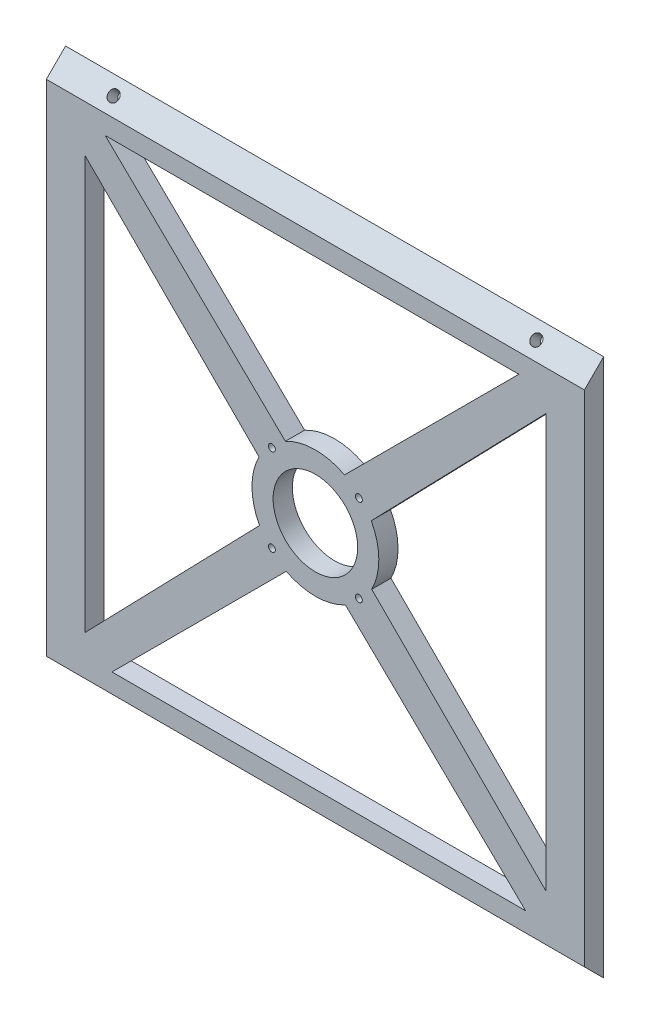
ISO-10303-21;
HEADER;
FILE_DESCRIPTION(('STEP AP214'),'2;1');
FILE_NAME('part.step','',(''),(''),'','','');
FILE_SCHEMA(('AUTOMOTIVE_DESIGN { 1 0 10303 214 1 1 1 1 }'));
ENDSEC;
DATA;
#1=APPLICATION_CONTEXT('core data for automotive mechanical design processes');
#2=APPLICATION_PROTOCOL_DEFINITION('international standard','automotive_design',2000,#1);
#3=PRODUCT_CONTEXT('',#1,'mechanical');
#4=PRODUCT('Part','Part','',(#3));
#5=PRODUCT_RELATED_PRODUCT_CATEGORY('part','',(#4));
#6=PRODUCT_DEFINITION_FORMATION('','',#4);
#7=PRODUCT_DEFINITION_CONTEXT('part definition',#1,'design');
#8=PRODUCT_DEFINITION('design','',#6,#7);
#9=PRODUCT_DEFINITION_SHAPE('','',#8);
#10=(LENGTH_UNIT() NAMED_UNIT(*) SI_UNIT(.MILLI.,.METRE.));
#11=(NAMED_UNIT(*) PLANE_ANGLE_UNIT() SI_UNIT($,.RADIAN.));
#12=(NAMED_UNIT(*) SI_UNIT($,.STERADIAN.) SOLID_ANGLE_UNIT());
#13=UNCERTAINTY_MEASURE_WITH_UNIT(LENGTH_MEASURE(1.E-05),#10,'distance_accuracy_value','');
#14=(GEOMETRIC_REPRESENTATION_CONTEXT(3) GLOBAL_UNCERTAINTY_ASSIGNED_CONTEXT((#13)) GLOBAL_UNIT_ASSIGNED_CONTEXT((#10,
#11,#12)) REPRESENTATION_CONTEXT('',''));
#15=CARTESIAN_POINT('',(0.,0.,0.));
#16=DIRECTION('',(0.,0.,1.));
#17=DIRECTION('',(1.,0.,0.));
#18=AXIS2_PLACEMENT_3D('',#15,#16,#17);
#19=CARTESIAN_POINT('',(70.,70.,5.));
#20=DIRECTION('',(-1.,0.,0.));
#21=DIRECTION('',(0.,0.,1.));
#22=AXIS2_PLACEMENT_3D('',#19,#20,#21);
#23=PLANE('',#22);
#24=DIRECTION('',(0.,1.,0.));
#25=VECTOR('',#24,1.);
#26=CARTESIAN_POINT('',(70.,70.,0.));
#27=LINE('',#26,#25);
#28=CARTESIAN_POINT('',(70.,-70.,0.));
#29=VERTEX_POINT('',#28);
#30=CARTESIAN_POINT('',(70.,70.,0.));
#31=VERTEX_POINT('',#30);
#32=EDGE_CURVE('E415',#29,#31,#27,.T.);
#33=ORIENTED_EDGE('',*,*,#32,.T.);
#34=DIRECTION('',(0.,-0.707106781186548,0.707106781186548));
#35=VECTOR('',#34,1.);
#36=CARTESIAN_POINT('',(70.,65.,5.));
#37=LINE('',#36,#35);
#38=CARTESIAN_POINT('',(70.,65.,5.));
#39=VERTEX_POINT('',#38);
#40=EDGE_CURVE('E11',#31,#39,#37,.T.);
#41=ORIENTED_EDGE('',*,*,#40,.T.);
#42=DIRECTION('',(0.,1.,0.));
#43=VECTOR('',#42,1.);
#44=CARTESIAN_POINT('',(70.,70.,5.));
#45=LINE('',#44,#43);
#46=CARTESIAN_POINT('',(70.,-65.,5.));
#47=VERTEX_POINT('',#46);
#48=EDGE_CURVE('E425',#47,#39,#45,.T.);
#49=ORIENTED_EDGE('',*,*,#48,.F.);
#50=DIRECTION('',(0.,-0.707106781186548,-0.707106781186548));
#51=VECTOR('',#50,1.);
#52=CARTESIAN_POINT('',(70.,-65.,5.));
#53=LINE('',#52,#51);
#54=EDGE_CURVE('E51',#47,#29,#53,.T.);
#55=ORIENTED_EDGE('',*,*,#54,.T.);
#56=EDGE_LOOP('',(#33,#41,#49,#55));
#57=FACE_BOUND('',#56,.T.);
#58=ADVANCED_FACE('F40',(#57),#23,.F.);
#59=CARTESIAN_POINT('',(-70.,70.,5.));
#60=DIRECTION('',(1.,0.,0.));
#61=DIRECTION('',(0.,0.,-1.));
#62=AXIS2_PLACEMENT_3D('',#59,#60,#61);
#63=PLANE('',#62);
#64=CARTESIAN_POINT('',(-70.,-63.,2.5));
#65=DIRECTION('',(-1.,0.,0.));
#66=DIRECTION('',(0.,0.,1.));
#67=AXIS2_PLACEMENT_3D('',#64,#65,#66);
#68=CIRCLE('',#67,1.4);
#69=CARTESIAN_POINT('',(-70.,-63.,3.9));
#70=VERTEX_POINT('',#69);
#71=EDGE_CURVE('E197',#70,#70,#68,.T.);
#72=ORIENTED_EDGE('',*,*,#71,.F.);
#73=EDGE_LOOP('',(#72));
#74=FACE_BOUND('',#73,.T.);
#75=CARTESIAN_POINT('',(-70.,63.,2.5));
#76=DIRECTION('',(-1.,0.,0.));
#77=DIRECTION('',(0.,0.,1.));
#78=AXIS2_PLACEMENT_3D('',#75,#76,#77);
#79=CIRCLE('',#78,1.4);
#80=CARTESIAN_POINT('',(-70.,63.,3.9));
#81=VERTEX_POINT('',#80);
#82=EDGE_CURVE('E196',#81,#81,#79,.T.);
#83=ORIENTED_EDGE('',*,*,#82,.F.);
#84=EDGE_LOOP('',(#83));
#85=FACE_BOUND('',#84,.T.);
#86=DIRECTION('',(0.,-1.,0.));
#87=VECTOR('',#86,1.);
#88=CARTESIAN_POINT('',(-70.,70.,5.));
#89=LINE('',#88,#87);
#90=CARTESIAN_POINT('',(-70.,65.,5.));
#91=VERTEX_POINT('',#90);
#92=CARTESIAN_POINT('',(-70.,-65.,5.));
#93=VERTEX_POINT('',#92);
#94=EDGE_CURVE('E429',#91,#93,#89,.T.);
#95=ORIENTED_EDGE('',*,*,#94,.F.);
#96=DIRECTION('',(0.,0.707106781186548,-0.707106781186548));
#97=VECTOR('',#96,1.);
#98=CARTESIAN_POINT('',(-70.,65.,5.));
#99=LINE('',#98,#97);
#100=CARTESIAN_POINT('',(-70.,70.,0.));
#101=VERTEX_POINT('',#100);
#102=EDGE_CURVE('E66',#91,#101,#99,.T.);
#103=ORIENTED_EDGE('',*,*,#102,.T.);
#104=DIRECTION('',(0.,-1.,0.));
#105=VECTOR('',#104,1.);
#106=CARTESIAN_POINT('',(-70.,70.,0.));
#107=LINE('',#106,#105);
#108=CARTESIAN_POINT('',(-70.,-70.,0.));
#109=VERTEX_POINT('',#108);
#110=EDGE_CURVE('E440',#101,#109,#107,.T.);
#111=ORIENTED_EDGE('',*,*,#110,.T.);
#112=DIRECTION('',(0.,0.707106781186548,0.707106781186548));
#113=VECTOR('',#112,1.);
#114=CARTESIAN_POINT('',(-70.,-65.,5.));
#115=LINE('',#114,#113);
#116=EDGE_CURVE('E58',#109,#93,#115,.T.);
#117=ORIENTED_EDGE('',*,*,#116,.T.);
#118=EDGE_LOOP('',(#95,#103,#111,#117));
#119=FACE_BOUND('',#118,.T.);
#120=ADVANCED_FACE('F472',(#74,#85,#119),#63,.F.);
#121=CARTESIAN_POINT('',(0.,0.,5.));
#122=DIRECTION('',(0.,0.,1.));
#123=DIRECTION('',(1.,0.,0.));
#124=AXIS2_PLACEMENT_3D('',#121,#122,#123);
#125=PLANE('',#124);
#126=CARTESIAN_POINT('',(-11.3137084989846,-11.3137084989849,5.));
#127=DIRECTION('',(0.,0.,1.));
#128=DIRECTION('',(1.,0.,0.));
#129=AXIS2_PLACEMENT_3D('',#126,#127,#128);
#130=CIRCLE('',#129,0.9);
#131=CARTESIAN_POINT('',(-10.4137084989846,-11.3137084989849,5.));
#132=VERTEX_POINT('',#131);
#133=EDGE_CURVE('E211',#132,#132,#130,.T.);
#134=ORIENTED_EDGE('',*,*,#133,.F.);
#135=EDGE_LOOP('',(#134));
#136=FACE_BOUND('',#135,.T.);
#137=CARTESIAN_POINT('',(-11.3137084989848,11.3137084989848,5.));
#138=DIRECTION('',(0.,0.,1.));
#139=DIRECTION('',(1.,0.,0.));
#140=AXIS2_PLACEMENT_3D('',#137,#138,#139);
#141=CIRCLE('',#140,0.9);
#142=CARTESIAN_POINT('',(-10.4137084989848,11.3137084989848,5.));
#143=VERTEX_POINT('',#142);
#144=EDGE_CURVE('E219',#143,#143,#141,.T.);
#145=ORIENTED_EDGE('',*,*,#144,.F.);
#146=EDGE_LOOP('',(#145));
#147=FACE_BOUND('',#146,.T.);
#148=CARTESIAN_POINT('',(11.3137084989847,11.3137084989848,5.));
#149=DIRECTION('',(0.,0.,1.));
#150=DIRECTION('',(1.,0.,0.));
#151=AXIS2_PLACEMENT_3D('',#148,#149,#150);
#152=CIRCLE('',#151,0.9);
#153=CARTESIAN_POINT('',(12.2137084989847,11.3137084989848,5.));
#154=VERTEX_POINT('',#153);
#155=EDGE_CURVE('E227',#154,#154,#152,.T.);
#156=ORIENTED_EDGE('',*,*,#155,.F.);
#157=EDGE_LOOP('',(#156));
#158=FACE_BOUND('',#157,.T.);
#159=CARTESIAN_POINT('',(11.3137084989848,-11.3137084989848,5.));
#160=DIRECTION('',(0.,0.,1.));
#161=DIRECTION('',(1.,0.,0.));
#162=AXIS2_PLACEMENT_3D('',#159,#160,#161);
#163=CIRCLE('',#162,0.9);
#164=CARTESIAN_POINT('',(12.2137084989848,-11.3137084989848,5.));
#165=VERTEX_POINT('',#164);
#166=EDGE_CURVE('E235',#165,#165,#163,.T.);
#167=ORIENTED_EDGE('',*,*,#166,.F.);
#168=EDGE_LOOP('',(#167));
#169=FACE_BOUND('',#168,.T.);
#170=CARTESIAN_POINT('',(0.,0.,5.));
#171=DIRECTION('',(0.,0.,1.));
#172=DIRECTION('',(1.,0.,0.));
#173=AXIS2_PLACEMENT_3D('',#170,#171,#172);
#174=CIRCLE('',#173,11.);
#175=CARTESIAN_POINT('',(11.,0.,5.));
#176=VERTEX_POINT('',#175);
#177=EDGE_CURVE('E240',#176,#176,#174,.T.);
#178=ORIENTED_EDGE('',*,*,#177,.F.);
#179=EDGE_LOOP('',(#178));
#180=FACE_BOUND('',#179,.T.);
#181=DIRECTION('',(1.,0.,0.));
#182=VECTOR('',#181,1.);
#183=CARTESIAN_POINT('',(54.68839472675,-60.,5.));
#184=LINE('',#183,#182);
#185=CARTESIAN_POINT('',(-52.9289321881345,-60.,5.));
#186=VERTEX_POINT('',#185);
#187=CARTESIAN_POINT('',(54.68839472675,-60.,5.));
#188=VERTEX_POINT('',#187);
#189=EDGE_CURVE('E283',#186,#188,#184,.T.);
#190=ORIENTED_EDGE('',*,*,#189,.F.);
#191=DIRECTION('',(-0.707106781186548,-0.707106781186547,0.));
#192=VECTOR('',#191,1.);
#193=CARTESIAN_POINT('',(-7.5831440730358,-14.6542118849013,5.));
#194=LINE('',#193,#192);
#195=CARTESIAN_POINT('',(-7.5831440730358,-14.6542118849013,5.));
#196=VERTEX_POINT('',#195);
#197=EDGE_CURVE('E298',#196,#186,#194,.T.);
#198=ORIENTED_EDGE('',*,*,#197,.F.);
#199=CARTESIAN_POINT('',(0.,0.,5.));
#200=DIRECTION('',(0.,0.,-1.));
#201=DIRECTION('',(1.,0.,0.));
#202=AXIS2_PLACEMENT_3D('',#199,#200,#201);
#203=CIRCLE('',#202,16.5);
#204=CARTESIAN_POINT('',(7.80758307049877,-14.5358744696444,5.));
#205=VERTEX_POINT('',#204);
#206=EDGE_CURVE('E317',#205,#196,#203,.T.);
#207=ORIENTED_EDGE('',*,*,#206,.F.);
#208=DIRECTION('',(-0.717870206431166,0.696176965087524,0.));
#209=VECTOR('',#208,1.);
#210=CARTESIAN_POINT('',(7.80758307049877,-14.5358744696444,5.));
#211=LINE('',#210,#209);
#212=EDGE_CURVE('E313',#188,#205,#211,.T.);
#213=ORIENTED_EDGE('',*,*,#212,.F.);
#214=EDGE_LOOP('',(#190,#198,#207,#213));
#215=FACE_BOUND('',#214,.T.);
#216=DIRECTION('',(0.,-1.,0.));
#217=VECTOR('',#216,1.);
#218=CARTESIAN_POINT('',(-60.0000000000006,-54.6883947267494,5.));
#219=LINE('',#218,#217);
#220=CARTESIAN_POINT('',(-59.9999999999995,52.9289321881352,5.));
#221=VERTEX_POINT('',#220);
#222=CARTESIAN_POINT('',(-60.0000000000006,-54.6883947267494,5.));
#223=VERTEX_POINT('',#222);
#224=EDGE_CURVE('E248',#221,#223,#219,.T.);
#225=ORIENTED_EDGE('',*,*,#224,.F.);
#226=DIRECTION('',(-0.70710678118654,0.707106781186555,0.));
#227=VECTOR('',#226,1.);
#228=CARTESIAN_POINT('',(-14.6542118849012,7.58314407303596,5.));
#229=LINE('',#228,#227);
#230=CARTESIAN_POINT('',(-14.6542118849012,7.58314407303596,5.));
#231=VERTEX_POINT('',#230);
#232=EDGE_CURVE('E254',#231,#221,#229,.T.);
#233=ORIENTED_EDGE('',*,*,#232,.F.);
#234=CARTESIAN_POINT('',(0.,0.,5.));
#235=DIRECTION('',(0.,0.,-1.));
#236=DIRECTION('',(0.,-1.,0.));
#237=AXIS2_PLACEMENT_3D('',#234,#235,#236);
#238=CIRCLE('',#237,16.5);
#239=CARTESIAN_POINT('',(-14.5358744696445,-7.80758307049861,5.));
#240=VERTEX_POINT('',#239);
#241=EDGE_CURVE('E273',#240,#231,#238,.T.);
#242=ORIENTED_EDGE('',*,*,#241,.F.);
#243=DIRECTION('',(0.696176965087531,0.717870206431159,0.));
#244=VECTOR('',#243,1.);
#245=CARTESIAN_POINT('',(-14.5358744696445,-7.80758307049861,5.));
#246=LINE('',#245,#244);
#247=EDGE_CURVE('E269',#223,#240,#246,.T.);
#248=ORIENTED_EDGE('',*,*,#247,.F.);
#249=EDGE_LOOP('',(#225,#233,#242,#248));
#250=FACE_BOUND('',#249,.T.);
#251=DIRECTION('',(0.,1.,0.));
#252=VECTOR('',#251,1.);
#253=CARTESIAN_POINT('',(60.0000000000002,54.6883947267498,5.));
#254=LINE('',#253,#252);
#255=CARTESIAN_POINT('',(59.9999999999998,-52.9289321881347,5.));
#256=VERTEX_POINT('',#255);
#257=CARTESIAN_POINT('',(60.0000000000002,54.6883947267498,5.));
#258=VERTEX_POINT('',#257);
#259=EDGE_CURVE('E327',#256,#258,#254,.T.);
#260=ORIENTED_EDGE('',*,*,#259,.F.);
#261=DIRECTION('',(0.707106781186545,-0.70710678118655,0.));
#262=VECTOR('',#261,1.);
#263=CARTESIAN_POINT('',(14.6542118849013,-7.58314407303586,5.));
#264=LINE('',#263,#262);
#265=CARTESIAN_POINT('',(14.6542118849013,-7.58314407303586,5.));
#266=VERTEX_POINT('',#265);
#267=EDGE_CURVE('E342',#266,#256,#264,.T.);
#268=ORIENTED_EDGE('',*,*,#267,.F.);
#269=CARTESIAN_POINT('',(0.,0.,5.));
#270=DIRECTION('',(0.,0.,-1.));
#271=DIRECTION('',(0.,1.,0.));
#272=AXIS2_PLACEMENT_3D('',#269,#270,#271);
#273=CIRCLE('',#272,16.5);
#274=CARTESIAN_POINT('',(14.5358744696445,7.80758307049872,5.));
#275=VERTEX_POINT('',#274);
#276=EDGE_CURVE('E361',#275,#266,#273,.T.);
#277=ORIENTED_EDGE('',*,*,#276,.F.);
#278=DIRECTION('',(-0.696176965087526,-0.717870206431164,0.));
#279=VECTOR('',#278,1.);
#280=CARTESIAN_POINT('',(14.5358744696445,7.80758307049872,5.));
#281=LINE('',#280,#279);
#282=EDGE_CURVE('E357',#258,#275,#281,.T.);
#283=ORIENTED_EDGE('',*,*,#282,.F.);
#284=EDGE_LOOP('',(#260,#268,#277,#283));
#285=FACE_BOUND('',#284,.T.);
#286=DIRECTION('',(-1.,0.,0.));
#287=VECTOR('',#286,1.);
#288=CARTESIAN_POINT('',(-54.68839472675,60.,5.));
#289=LINE('',#288,#287);
#290=CARTESIAN_POINT('',(52.9289321881345,60.,5.));
#291=VERTEX_POINT('',#290);
#292=CARTESIAN_POINT('',(-54.68839472675,60.,5.));
#293=VERTEX_POINT('',#292);
#294=EDGE_CURVE('E371',#291,#293,#289,.T.);
#295=ORIENTED_EDGE('',*,*,#294,.F.);
#296=DIRECTION('',(0.707106781186548,0.707106781186547,0.));
#297=VECTOR('',#296,1.);
#298=CARTESIAN_POINT('',(7.5831440730358,14.6542118849013,5.));
#299=LINE('',#298,#297);
#300=CARTESIAN_POINT('',(7.5831440730358,14.6542118849013,5.));
#301=VERTEX_POINT('',#300);
#302=EDGE_CURVE('E386',#301,#291,#299,.T.);
#303=ORIENTED_EDGE('',*,*,#302,.F.);
#304=CARTESIAN_POINT('',(0.,0.,5.));
#305=DIRECTION('',(0.,0.,-1.));
#306=DIRECTION('',(-1.,0.,0.));
#307=AXIS2_PLACEMENT_3D('',#304,#305,#306);
#308=CIRCLE('',#307,16.5);
#309=CARTESIAN_POINT('',(-7.80758307049877,14.5358744696444,5.));
#310=VERTEX_POINT('',#309);
#311=EDGE_CURVE('E405',#310,#301,#308,.T.);
#312=ORIENTED_EDGE('',*,*,#311,.F.);
#313=DIRECTION('',(0.717870206431166,-0.696176965087524,0.));
#314=VECTOR('',#313,1.);
#315=CARTESIAN_POINT('',(-7.80758307049877,14.5358744696444,5.));
#316=LINE('',#315,#314);
#317=EDGE_CURVE('E401',#293,#310,#316,.T.);
#318=ORIENTED_EDGE('',*,*,#317,.F.);
#319=EDGE_LOOP('',(#295,#303,#312,#318));
#320=FACE_BOUND('',#319,.T.);
#321=ORIENTED_EDGE('',*,*,#48,.T.);
#322=DIRECTION('',(-1.,0.,0.));
#323=VECTOR('',#322,1.);
#324=CARTESIAN_POINT('',(-70.,65.,5.));
#325=LINE('',#324,#323);
#326=EDGE_CURVE('E452',#39,#91,#325,.T.);
#327=ORIENTED_EDGE('',*,*,#326,.T.);
#328=ORIENTED_EDGE('',*,*,#94,.T.);
#329=DIRECTION('',(1.,0.,0.));
#330=VECTOR('',#329,1.);
#331=CARTESIAN_POINT('',(70.,-65.,5.));
#332=LINE('',#331,#330);
#333=EDGE_CURVE('E433',#93,#47,#332,.T.);
#334=ORIENTED_EDGE('',*,*,#333,.T.);
#335=EDGE_LOOP('',(#321,#327,#328,#334));
#336=FACE_BOUND('',#335,.T.);
#337=ADVANCED_FACE('F471',(#136,#147,#158,#169,#180,#215,#250,#285,#320,#336),#125,.T.);
#338=CARTESIAN_POINT('',(0.,0.,0.));
#339=DIRECTION('',(0.,0.,1.));
#340=DIRECTION('',(1.,0.,0.));
#341=AXIS2_PLACEMENT_3D('',#338,#339,#340);
#342=PLANE('',#341);
#343=CARTESIAN_POINT('',(55.,-65.,0.));
#344=DIRECTION('',(0.,0.,1.));
#345=DIRECTION('',(0.,-1.,0.));
#346=AXIS2_PLACEMENT_3D('',#343,#344,#345);
#347=ELLIPSE('',#346,1.97989898732232,1.39999999999999);
#348=CARTESIAN_POINT('',(55.,-66.9798989873223,0.));
#349=VERTEX_POINT('',#348);
#350=EDGE_CURVE('E614',#349,#349,#347,.T.);
#351=ORIENTED_EDGE('',*,*,#350,.T.);
#352=EDGE_LOOP('',(#351));
#353=FACE_BOUND('',#352,.T.);
#354=CARTESIAN_POINT('',(-55.,-65.,0.));
#355=DIRECTION('',(0.,0.,1.));
#356=DIRECTION('',(0.,-1.,0.));
#357=AXIS2_PLACEMENT_3D('',#354,#355,#356);
#358=ELLIPSE('',#357,1.97989898732232,1.39999999999999);
#359=CARTESIAN_POINT('',(-55.,-66.9798989873223,0.));
#360=VERTEX_POINT('',#359);
#361=EDGE_CURVE('E621',#360,#360,#358,.T.);
#362=ORIENTED_EDGE('',*,*,#361,.T.);
#363=EDGE_LOOP('',(#362));
#364=FACE_BOUND('',#363,.T.);
#365=CARTESIAN_POINT('',(-55.,65.,0.));
#366=DIRECTION('',(0.,0.,1.));
#367=DIRECTION('',(0.,1.,0.));
#368=AXIS2_PLACEMENT_3D('',#365,#366,#367);
#369=ELLIPSE('',#368,1.97989898732232,1.39999999999999);
#370=CARTESIAN_POINT('',(-55.,66.9798989873223,0.));
#371=VERTEX_POINT('',#370);
#372=EDGE_CURVE('E632',#371,#371,#369,.T.);
#373=ORIENTED_EDGE('',*,*,#372,.T.);
#374=EDGE_LOOP('',(#373));
#375=FACE_BOUND('',#374,.T.);
#376=CARTESIAN_POINT('',(55.,65.,0.));
#377=DIRECTION('',(0.,0.,1.));
#378=DIRECTION('',(0.,1.,0.));
#379=AXIS2_PLACEMENT_3D('',#376,#377,#378);
#380=ELLIPSE('',#379,1.97989898732232,1.39999999999999);
#381=CARTESIAN_POINT('',(55.,66.9798989873223,0.));
#382=VERTEX_POINT('',#381);
#383=EDGE_CURVE('E45',#382,#382,#380,.T.);
#384=ORIENTED_EDGE('',*,*,#383,.T.);
#385=EDGE_LOOP('',(#384));
#386=FACE_BOUND('',#385,.T.);
#387=CARTESIAN_POINT('',(-11.3137084989846,-11.3137084989849,0.));
#388=DIRECTION('',(0.,0.,1.));
#389=DIRECTION('',(1.,0.,0.));
#390=AXIS2_PLACEMENT_3D('',#387,#388,#389);
#391=CIRCLE('',#390,0.899999999999999);
#392=CARTESIAN_POINT('',(-10.4137084989846,-11.3137084989849,0.));
#393=VERTEX_POINT('',#392);
#394=EDGE_CURVE('E215',#393,#393,#391,.T.);
#395=ORIENTED_EDGE('',*,*,#394,.T.);
#396=EDGE_LOOP('',(#395));
#397=FACE_BOUND('',#396,.T.);
#398=CARTESIAN_POINT('',(-11.3137084989848,11.3137084989848,0.));
#399=DIRECTION('',(0.,0.,1.));
#400=DIRECTION('',(1.,0.,0.));
#401=AXIS2_PLACEMENT_3D('',#398,#399,#400);
#402=CIRCLE('',#401,0.899999999999999);
#403=CARTESIAN_POINT('',(-10.4137084989848,11.3137084989848,0.));
#404=VERTEX_POINT('',#403);
#405=EDGE_CURVE('E223',#404,#404,#402,.T.);
#406=ORIENTED_EDGE('',*,*,#405,.T.);
#407=EDGE_LOOP('',(#406));
#408=FACE_BOUND('',#407,.T.);
#409=CARTESIAN_POINT('',(11.3137084989847,11.3137084989848,0.));
#410=DIRECTION('',(0.,0.,1.));
#411=DIRECTION('',(1.,0.,0.));
#412=AXIS2_PLACEMENT_3D('',#409,#410,#411);
#413=CIRCLE('',#412,0.899999999999999);
#414=CARTESIAN_POINT('',(12.2137084989847,11.3137084989848,0.));
#415=VERTEX_POINT('',#414);
#416=EDGE_CURVE('E231',#415,#415,#413,.T.);
#417=ORIENTED_EDGE('',*,*,#416,.T.);
#418=EDGE_LOOP('',(#417));
#419=FACE_BOUND('',#418,.T.);
#420=CARTESIAN_POINT('',(11.3137084989848,-11.3137084989848,0.));
#421=DIRECTION('',(0.,0.,1.));
#422=DIRECTION('',(1.,0.,0.));
#423=AXIS2_PLACEMENT_3D('',#420,#421,#422);
#424=CIRCLE('',#423,0.899999999999999);
#425=CARTESIAN_POINT('',(12.2137084989848,-11.3137084989848,0.));
#426=VERTEX_POINT('',#425);
#427=EDGE_CURVE('E239',#426,#426,#424,.T.);
#428=ORIENTED_EDGE('',*,*,#427,.T.);
#429=EDGE_LOOP('',(#428));
#430=FACE_BOUND('',#429,.T.);
#431=CARTESIAN_POINT('',(0.,0.,0.));
#432=DIRECTION('',(0.,0.,1.));
#433=DIRECTION('',(1.,0.,0.));
#434=AXIS2_PLACEMENT_3D('',#431,#432,#433);
#435=CIRCLE('',#434,11.);
#436=CARTESIAN_POINT('',(11.,0.,0.));
#437=VERTEX_POINT('',#436);
#438=EDGE_CURVE('E244',#437,#437,#435,.F.);
#439=ORIENTED_EDGE('',*,*,#438,.F.);
#440=EDGE_LOOP('',(#439));
#441=FACE_BOUND('',#440,.T.);
#442=DIRECTION('',(-0.707106781186548,-0.707106781186547,0.));
#443=VECTOR('',#442,1.);
#444=CARTESIAN_POINT('',(-7.5831440730358,-14.6542118849013,0.));
#445=LINE('',#444,#443);
#446=CARTESIAN_POINT('',(-7.5831440730358,-14.6542118849013,0.));
#447=VERTEX_POINT('',#446);
#448=CARTESIAN_POINT('',(-52.9289321881345,-60.,0.));
#449=VERTEX_POINT('',#448);
#450=EDGE_CURVE('E306',#447,#449,#445,.T.);
#451=ORIENTED_EDGE('',*,*,#450,.T.);
#452=DIRECTION('',(1.,0.,0.));
#453=VECTOR('',#452,1.);
#454=CARTESIAN_POINT('',(54.68839472675,-60.,0.));
#455=LINE('',#454,#453);
#456=CARTESIAN_POINT('',(54.68839472675,-60.,0.));
#457=VERTEX_POINT('',#456);
#458=EDGE_CURVE('E293',#449,#457,#455,.T.);
#459=ORIENTED_EDGE('',*,*,#458,.T.);
#460=DIRECTION('',(-0.717870206431166,0.696176965087524,0.));
#461=VECTOR('',#460,1.);
#462=CARTESIAN_POINT('',(7.80758307049877,-14.5358744696444,0.));
#463=LINE('',#462,#461);
#464=CARTESIAN_POINT('',(7.80758307049877,-14.5358744696444,0.));
#465=VERTEX_POINT('',#464);
#466=EDGE_CURVE('E297',#457,#465,#463,.T.);
#467=ORIENTED_EDGE('',*,*,#466,.T.);
#468=CARTESIAN_POINT('',(0.,0.,0.));
#469=DIRECTION('',(0.,0.,-1.));
#470=DIRECTION('',(1.,0.,0.));
#471=AXIS2_PLACEMENT_3D('',#468,#469,#470);
#472=CIRCLE('',#471,16.5);
#473=EDGE_CURVE('E302',#465,#447,#472,.T.);
#474=ORIENTED_EDGE('',*,*,#473,.T.);
#475=EDGE_LOOP('',(#451,#459,#467,#474));
#476=FACE_BOUND('',#475,.T.);
#477=DIRECTION('',(-0.70710678118654,0.707106781186555,0.));
#478=VECTOR('',#477,1.);
#479=CARTESIAN_POINT('',(-14.6542118849012,7.58314407303596,0.));
#480=LINE('',#479,#478);
#481=CARTESIAN_POINT('',(-14.6542118849012,7.58314407303596,0.));
#482=VERTEX_POINT('',#481);
#483=CARTESIAN_POINT('',(-59.9999999999995,52.9289321881352,0.));
#484=VERTEX_POINT('',#483);
#485=EDGE_CURVE('E262',#482,#484,#480,.T.);
#486=ORIENTED_EDGE('',*,*,#485,.T.);
#487=DIRECTION('',(0.,-1.,0.));
#488=VECTOR('',#487,1.);
#489=CARTESIAN_POINT('',(-60.0000000000006,-54.6883947267494,0.));
#490=LINE('',#489,#488);
#491=CARTESIAN_POINT('',(-60.0000000000006,-54.6883947267494,0.));
#492=VERTEX_POINT('',#491);
#493=EDGE_CURVE('E249',#484,#492,#490,.T.);
#494=ORIENTED_EDGE('',*,*,#493,.T.);
#495=DIRECTION('',(0.696176965087531,0.717870206431159,0.));
#496=VECTOR('',#495,1.);
#497=CARTESIAN_POINT('',(-14.5358744696445,-7.80758307049861,0.));
#498=LINE('',#497,#496);
#499=CARTESIAN_POINT('',(-14.5358744696445,-7.80758307049862,0.));
#500=VERTEX_POINT('',#499);
#501=EDGE_CURVE('E253',#492,#500,#498,.T.);
#502=ORIENTED_EDGE('',*,*,#501,.T.);
#503=CARTESIAN_POINT('',(0.,0.,0.));
#504=DIRECTION('',(0.,0.,-1.));
#505=DIRECTION('',(0.,-1.,0.));
#506=AXIS2_PLACEMENT_3D('',#503,#504,#505);
#507=CIRCLE('',#506,16.5);
#508=EDGE_CURVE('E258',#500,#482,#507,.T.);
#509=ORIENTED_EDGE('',*,*,#508,.T.);
#510=EDGE_LOOP('',(#486,#494,#502,#509));
#511=FACE_BOUND('',#510,.T.);
#512=DIRECTION('',(0.707106781186545,-0.70710678118655,0.));
#513=VECTOR('',#512,1.);
#514=CARTESIAN_POINT('',(14.6542118849013,-7.58314407303586,0.));
#515=LINE('',#514,#513);
#516=CARTESIAN_POINT('',(14.6542118849013,-7.58314407303586,0.));
#517=VERTEX_POINT('',#516);
#518=CARTESIAN_POINT('',(59.9999999999998,-52.9289321881347,0.));
#519=VERTEX_POINT('',#518);
#520=EDGE_CURVE('E350',#517,#519,#515,.T.);
#521=ORIENTED_EDGE('',*,*,#520,.T.);
#522=DIRECTION('',(0.,1.,0.));
#523=VECTOR('',#522,1.);
#524=CARTESIAN_POINT('',(60.0000000000002,54.6883947267498,0.));
#525=LINE('',#524,#523);
#526=CARTESIAN_POINT('',(60.0000000000002,54.6883947267498,0.));
#527=VERTEX_POINT('',#526);
#528=EDGE_CURVE('E337',#519,#527,#525,.T.);
#529=ORIENTED_EDGE('',*,*,#528,.T.);
#530=DIRECTION('',(-0.696176965087526,-0.717870206431164,0.));
#531=VECTOR('',#530,1.);
#532=CARTESIAN_POINT('',(14.5358744696445,7.80758307049872,0.));
#533=LINE('',#532,#531);
#534=CARTESIAN_POINT('',(14.5358744696445,7.80758307049872,0.));
#535=VERTEX_POINT('',#534);
#536=EDGE_CURVE('E341',#527,#535,#533,.T.);
#537=ORIENTED_EDGE('',*,*,#536,.T.);
#538=CARTESIAN_POINT('',(0.,0.,0.));
#539=DIRECTION('',(0.,0.,-1.));
#540=DIRECTION('',(0.,1.,0.));
#541=AXIS2_PLACEMENT_3D('',#538,#539,#540);
#542=CIRCLE('',#541,16.5);
#543=EDGE_CURVE('E346',#535,#517,#542,.T.);
#544=ORIENTED_EDGE('',*,*,#543,.T.);
#545=EDGE_LOOP('',(#521,#529,#537,#544));
#546=FACE_BOUND('',#545,.T.);
#547=DIRECTION('',(0.707106781186548,0.707106781186547,0.));
#548=VECTOR('',#547,1.);
#549=CARTESIAN_POINT('',(7.5831440730358,14.6542118849013,0.));
#550=LINE('',#549,#548);
#551=CARTESIAN_POINT('',(7.5831440730358,14.6542118849013,0.));
#552=VERTEX_POINT('',#551);
#553=CARTESIAN_POINT('',(52.9289321881345,60.,0.));
#554=VERTEX_POINT('',#553);
#555=EDGE_CURVE('E394',#552,#554,#550,.T.);
#556=ORIENTED_EDGE('',*,*,#555,.T.);
#557=DIRECTION('',(-1.,0.,0.));
#558=VECTOR('',#557,1.);
#559=CARTESIAN_POINT('',(-54.68839472675,60.,0.));
#560=LINE('',#559,#558);
#561=CARTESIAN_POINT('',(-54.68839472675,60.,0.));
#562=VERTEX_POINT('',#561);
#563=EDGE_CURVE('E381',#554,#562,#560,.T.);
#564=ORIENTED_EDGE('',*,*,#563,.T.);
#565=DIRECTION('',(0.717870206431166,-0.696176965087524,0.));
#566=VECTOR('',#565,1.);
#567=CARTESIAN_POINT('',(-7.80758307049877,14.5358744696444,0.));
#568=LINE('',#567,#566);
#569=CARTESIAN_POINT('',(-7.80758307049877,14.5358744696444,0.));
#570=VERTEX_POINT('',#569);
#571=EDGE_CURVE('E385',#562,#570,#568,.T.);
#572=ORIENTED_EDGE('',*,*,#571,.T.);
#573=CARTESIAN_POINT('',(0.,0.,0.));
#574=DIRECTION('',(0.,0.,-1.));
#575=DIRECTION('',(-1.,0.,0.));
#576=AXIS2_PLACEMENT_3D('',#573,#574,#575);
#577=CIRCLE('',#576,16.5);
#578=EDGE_CURVE('E390',#570,#552,#577,.T.);
#579=ORIENTED_EDGE('',*,*,#578,.T.);
#580=EDGE_LOOP('',(#556,#564,#572,#579));
#581=FACE_BOUND('',#580,.T.);
#582=ORIENTED_EDGE('',*,*,#32,.F.);
#583=DIRECTION('',(1.,0.,0.));
#584=VECTOR('',#583,1.);
#585=CARTESIAN_POINT('',(-70.,-70.,0.));
#586=LINE('',#585,#584);
#587=EDGE_CURVE('E430',#109,#29,#586,.T.);
#588=ORIENTED_EDGE('',*,*,#587,.F.);
#589=ORIENTED_EDGE('',*,*,#110,.F.);
#590=DIRECTION('',(-1.,0.,0.));
#591=VECTOR('',#590,1.);
#592=CARTESIAN_POINT('',(-70.,70.,0.));
#593=LINE('',#592,#591);
#594=EDGE_CURVE('E437',#31,#101,#593,.T.);
#595=ORIENTED_EDGE('',*,*,#594,.F.);
#596=EDGE_LOOP('',(#582,#588,#589,#595));
#597=FACE_BOUND('',#596,.T.);
#598=ADVANCED_FACE('F468',(#353,#364,#375,#386,#397,#408,#419,#430,#441,#476,#511,#546,#581,
#597),#342,.F.);
#599=CARTESIAN_POINT('',(-54.68839472675,60.,0.));
#600=DIRECTION('',(0.,1.,0.));
#601=DIRECTION('',(0.,0.,1.));
#602=AXIS2_PLACEMENT_3D('',#599,#600,#601);
#603=PLANE('',#602);
#604=ORIENTED_EDGE('',*,*,#294,.T.);
#605=DIRECTION('',(0.,0.,1.));
#606=VECTOR('',#605,1.);
#607=CARTESIAN_POINT('',(-54.68839472675,60.,0.));
#608=LINE('',#607,#606);
#609=EDGE_CURVE('E398',#562,#293,#608,.T.);
#610=ORIENTED_EDGE('',*,*,#609,.F.);
#611=ORIENTED_EDGE('',*,*,#563,.F.);
#612=DIRECTION('',(0.,0.,1.));
#613=VECTOR('',#612,1.);
#614=CARTESIAN_POINT('',(52.9289321881345,60.,0.));
#615=LINE('',#614,#613);
#616=EDGE_CURVE('E412',#554,#291,#615,.T.);
#617=ORIENTED_EDGE('',*,*,#616,.T.);
#618=EDGE_LOOP('',(#604,#610,#611,#617));
#619=FACE_BOUND('',#618,.T.);
#620=ADVANCED_FACE('F501',(#619),#603,.F.);
#621=CARTESIAN_POINT('',(7.5831440730358,14.6542118849013,0.));
#622=DIRECTION('',(0.707106781186547,-0.707106781186548,0.));
#623=DIRECTION('',(0.707106781186548,0.707106781186547,0.));
#624=AXIS2_PLACEMENT_3D('',#621,#622,#623);
#625=PLANE('',#624);
#626=ORIENTED_EDGE('',*,*,#302,.T.);
#627=ORIENTED_EDGE('',*,*,#616,.F.);
#628=ORIENTED_EDGE('',*,*,#555,.F.);
#629=DIRECTION('',(0.,0.,1.));
#630=VECTOR('',#629,1.);
#631=CARTESIAN_POINT('',(7.5831440730358,14.6542118849013,0.));
#632=LINE('',#631,#630);
#633=EDGE_CURVE('E416',#552,#301,#632,.T.);
#634=ORIENTED_EDGE('',*,*,#633,.T.);
#635=EDGE_LOOP('',(#626,#627,#628,#634));
#636=FACE_BOUND('',#635,.T.);
#637=ADVANCED_FACE('F507',(#636),#625,.F.);
#638=CARTESIAN_POINT('',(0.,0.,0.));
#639=DIRECTION('',(0.,0.,1.));
#640=DIRECTION('',(1.,0.,0.));
#641=AXIS2_PLACEMENT_3D('',#638,#639,#640);
#642=CYLINDRICAL_SURFACE('',#641,16.5);
#643=ORIENTED_EDGE('',*,*,#311,.T.);
#644=ORIENTED_EDGE('',*,*,#633,.F.);
#645=ORIENTED_EDGE('',*,*,#578,.F.);
#646=DIRECTION('',(0.,0.,1.));
#647=VECTOR('',#646,1.);
#648=CARTESIAN_POINT('',(-7.80758307049877,14.5358744696444,0.));
#649=LINE('',#648,#647);
#650=EDGE_CURVE('E419',#570,#310,#649,.T.);
#651=ORIENTED_EDGE('',*,*,#650,.T.);
#652=EDGE_LOOP('',(#643,#644,#645,#651));
#653=FACE_BOUND('',#652,.T.);
#654=ADVANCED_FACE('F513',(#653),#642,.T.);
#655=CARTESIAN_POINT('',(-7.80758307049877,14.5358744696444,0.));
#656=DIRECTION('',(-0.696176965087523,-0.717870206431166,0.));
#657=DIRECTION('',(0.717870206431166,-0.696176965087523,0.));
#658=AXIS2_PLACEMENT_3D('',#655,#656,#657);
#659=PLANE('',#658);
#660=ORIENTED_EDGE('',*,*,#317,.T.);
#661=ORIENTED_EDGE('',*,*,#650,.F.);
#662=ORIENTED_EDGE('',*,*,#571,.F.);
#663=ORIENTED_EDGE('',*,*,#609,.T.);
#664=EDGE_LOOP('',(#660,#661,#662,#663));
#665=FACE_BOUND('',#664,.T.);
#666=ADVANCED_FACE('F509',(#665),#659,.F.);
#667=CARTESIAN_POINT('',(60.0000000000002,54.6883947267498,0.));
#668=DIRECTION('',(1.,0.,0.));
#669=DIRECTION('',(0.,1.,0.));
#670=AXIS2_PLACEMENT_3D('',#667,#668,#669);
#671=PLANE('',#670);
#672=ORIENTED_EDGE('',*,*,#259,.T.);
#673=DIRECTION('',(0.,0.,1.));
#674=VECTOR('',#673,1.);
#675=CARTESIAN_POINT('',(60.0000000000002,54.6883947267498,0.));
#676=LINE('',#675,#674);
#677=EDGE_CURVE('E354',#527,#258,#676,.T.);
#678=ORIENTED_EDGE('',*,*,#677,.F.);
#679=ORIENTED_EDGE('',*,*,#528,.F.);
#680=DIRECTION('',(0.,0.,1.));
#681=VECTOR('',#680,1.);
#682=CARTESIAN_POINT('',(59.9999999999998,-52.9289321881347,0.));
#683=LINE('',#682,#681);
#684=EDGE_CURVE('E368',#519,#256,#683,.T.);
#685=ORIENTED_EDGE('',*,*,#684,.T.);
#686=EDGE_LOOP('',(#672,#678,#679,#685));
#687=FACE_BOUND('',#686,.T.);
#688=ADVANCED_FACE('F512',(#687),#671,.F.);
#689=CARTESIAN_POINT('',(14.6542118849013,-7.58314407303586,0.));
#690=DIRECTION('',(-0.70710678118655,-0.707106781186545,0.));
#691=DIRECTION('',(0.707106781186545,-0.70710678118655,0.));
#692=AXIS2_PLACEMENT_3D('',#689,#690,#691);
#693=PLANE('',#692);
#694=ORIENTED_EDGE('',*,*,#267,.T.);
#695=ORIENTED_EDGE('',*,*,#684,.F.);
#696=ORIENTED_EDGE('',*,*,#520,.F.);
#697=DIRECTION('',(0.,0.,1.));
#698=VECTOR('',#697,1.);
#699=CARTESIAN_POINT('',(14.6542118849013,-7.58314407303586,0.));
#700=LINE('',#699,#698);
#701=EDGE_CURVE('E372',#517,#266,#700,.T.);
#702=ORIENTED_EDGE('',*,*,#701,.T.);
#703=EDGE_LOOP('',(#694,#695,#696,#702));
#704=FACE_BOUND('',#703,.T.);
#705=ADVANCED_FACE('F523',(#704),#693,.F.);
#706=CARTESIAN_POINT('',(0.,0.,0.));
#707=DIRECTION('',(0.,0.,1.));
#708=DIRECTION('',(1.,0.,0.));
#709=AXIS2_PLACEMENT_3D('',#706,#707,#708);
#710=CYLINDRICAL_SURFACE('',#709,16.5);
#711=ORIENTED_EDGE('',*,*,#276,.T.);
#712=ORIENTED_EDGE('',*,*,#701,.F.);
#713=ORIENTED_EDGE('',*,*,#543,.F.);
#714=DIRECTION('',(0.,0.,1.));
#715=VECTOR('',#714,1.);
#716=CARTESIAN_POINT('',(14.5358744696445,7.80758307049872,0.));
#717=LINE('',#716,#715);
#718=EDGE_CURVE('E375',#535,#275,#717,.T.);
#719=ORIENTED_EDGE('',*,*,#718,.T.);
#720=EDGE_LOOP('',(#711,#712,#713,#719));
#721=FACE_BOUND('',#720,.T.);
#722=ADVANCED_FACE('F529',(#721),#710,.T.);
#723=CARTESIAN_POINT('',(14.5358744696445,7.80758307049872,0.));
#724=DIRECTION('',(-0.717870206431164,0.696176965087526,0.));
#725=DIRECTION('',(-0.696176965087526,-0.717870206431164,0.));
#726=AXIS2_PLACEMENT_3D('',#723,#724,#725);
#727=PLANE('',#726);
#728=ORIENTED_EDGE('',*,*,#282,.T.);
#729=ORIENTED_EDGE('',*,*,#718,.F.);
#730=ORIENTED_EDGE('',*,*,#536,.F.);
#731=ORIENTED_EDGE('',*,*,#677,.T.);
#732=EDGE_LOOP('',(#728,#729,#730,#731));
#733=FACE_BOUND('',#732,.T.);
#734=ADVANCED_FACE('F525',(#733),#727,.F.);
#735=CARTESIAN_POINT('',(-60.0000000000006,-54.6883947267494,0.));
#736=DIRECTION('',(-1.,0.,0.));
#737=DIRECTION('',(0.,-1.,0.));
#738=AXIS2_PLACEMENT_3D('',#735,#736,#737);
#739=PLANE('',#738);
#740=ORIENTED_EDGE('',*,*,#224,.T.);
#741=DIRECTION('',(0.,0.,1.));
#742=VECTOR('',#741,1.);
#743=CARTESIAN_POINT('',(-60.0000000000006,-54.6883947267494,0.));
#744=LINE('',#743,#742);
#745=EDGE_CURVE('E266',#492,#223,#744,.T.);
#746=ORIENTED_EDGE('',*,*,#745,.F.);
#747=ORIENTED_EDGE('',*,*,#493,.F.);
#748=DIRECTION('',(0.,0.,1.));
#749=VECTOR('',#748,1.);
#750=CARTESIAN_POINT('',(-59.9999999999995,52.9289321881352,0.));
#751=LINE('',#750,#749);
#752=EDGE_CURVE('E280',#484,#221,#751,.T.);
#753=ORIENTED_EDGE('',*,*,#752,.T.);
#754=EDGE_LOOP('',(#740,#746,#747,#753));
#755=FACE_BOUND('',#754,.T.);
#756=ADVANCED_FACE('F528',(#755),#739,.F.);
#757=CARTESIAN_POINT('',(-14.6542118849012,7.58314407303596,0.));
#758=DIRECTION('',(0.707106781186555,0.70710678118654,0.));
#759=DIRECTION('',(-0.70710678118654,0.707106781186555,0.));
#760=AXIS2_PLACEMENT_3D('',#757,#758,#759);
#761=PLANE('',#760);
#762=ORIENTED_EDGE('',*,*,#232,.T.);
#763=ORIENTED_EDGE('',*,*,#752,.F.);
#764=ORIENTED_EDGE('',*,*,#485,.F.);
#765=DIRECTION('',(0.,0.,1.));
#766=VECTOR('',#765,1.);
#767=CARTESIAN_POINT('',(-14.6542118849012,7.58314407303596,0.));
#768=LINE('',#767,#766);
#769=EDGE_CURVE('E284',#482,#231,#768,.T.);
#770=ORIENTED_EDGE('',*,*,#769,.T.);
#771=EDGE_LOOP('',(#762,#763,#764,#770));
#772=FACE_BOUND('',#771,.T.);
#773=ADVANCED_FACE('F557',(#772),#761,.F.);
#774=CARTESIAN_POINT('',(0.,0.,0.));
#775=DIRECTION('',(0.,0.,1.));
#776=DIRECTION('',(1.,0.,0.));
#777=AXIS2_PLACEMENT_3D('',#774,#775,#776);
#778=CYLINDRICAL_SURFACE('',#777,16.5);
#779=ORIENTED_EDGE('',*,*,#241,.T.);
#780=ORIENTED_EDGE('',*,*,#769,.F.);
#781=ORIENTED_EDGE('',*,*,#508,.F.);
#782=DIRECTION('',(0.,0.,1.));
#783=VECTOR('',#782,1.);
#784=CARTESIAN_POINT('',(-14.5358744696445,-7.80758307049861,0.));
#785=LINE('',#784,#783);
#786=EDGE_CURVE('E287',#500,#240,#785,.T.);
#787=ORIENTED_EDGE('',*,*,#786,.T.);
#788=EDGE_LOOP('',(#779,#780,#781,#787));
#789=FACE_BOUND('',#788,.T.);
#790=ADVANCED_FACE('F561',(#789),#778,.T.);
#791=CARTESIAN_POINT('',(-14.5358744696445,-7.80758307049861,0.));
#792=DIRECTION('',(0.717870206431159,-0.696176965087531,0.));
#793=DIRECTION('',(0.696176965087531,0.717870206431159,0.));
#794=AXIS2_PLACEMENT_3D('',#791,#792,#793);
#795=PLANE('',#794);
#796=ORIENTED_EDGE('',*,*,#247,.T.);
#797=ORIENTED_EDGE('',*,*,#786,.F.);
#798=ORIENTED_EDGE('',*,*,#501,.F.);
#799=ORIENTED_EDGE('',*,*,#745,.T.);
#800=EDGE_LOOP('',(#796,#797,#798,#799));
#801=FACE_BOUND('',#800,.T.);
#802=ADVANCED_FACE('F541',(#801),#795,.F.);
#803=CARTESIAN_POINT('',(54.68839472675,-60.,0.));
#804=DIRECTION('',(0.,-1.,0.));
#805=DIRECTION('',(0.,0.,-1.));
#806=AXIS2_PLACEMENT_3D('',#803,#804,#805);
#807=PLANE('',#806);
#808=ORIENTED_EDGE('',*,*,#189,.T.);
#809=DIRECTION('',(0.,0.,1.));
#810=VECTOR('',#809,1.);
#811=CARTESIAN_POINT('',(54.68839472675,-60.,0.));
#812=LINE('',#811,#810);
#813=EDGE_CURVE('E310',#457,#188,#812,.T.);
#814=ORIENTED_EDGE('',*,*,#813,.F.);
#815=ORIENTED_EDGE('',*,*,#458,.F.);
#816=DIRECTION('',(0.,0.,1.));
#817=VECTOR('',#816,1.);
#818=CARTESIAN_POINT('',(-52.9289321881345,-60.,0.));
#819=LINE('',#818,#817);
#820=EDGE_CURVE('E324',#449,#186,#819,.T.);
#821=ORIENTED_EDGE('',*,*,#820,.T.);
#822=EDGE_LOOP('',(#808,#814,#815,#821));
#823=FACE_BOUND('',#822,.T.);
#824=ADVANCED_FACE('F537',(#823),#807,.F.);
#825=CARTESIAN_POINT('',(-7.5831440730358,-14.6542118849013,0.));
#826=DIRECTION('',(-0.707106781186547,0.707106781186548,0.));
#827=DIRECTION('',(-0.707106781186548,-0.707106781186547,0.));
#828=AXIS2_PLACEMENT_3D('',#825,#826,#827);
#829=PLANE('',#828);
#830=ORIENTED_EDGE('',*,*,#197,.T.);
#831=ORIENTED_EDGE('',*,*,#820,.F.);
#832=ORIENTED_EDGE('',*,*,#450,.F.);
#833=DIRECTION('',(0.,0.,1.));
#834=VECTOR('',#833,1.);
#835=CARTESIAN_POINT('',(-7.5831440730358,-14.6542118849013,0.));
#836=LINE('',#835,#834);
#837=EDGE_CURVE('E328',#447,#196,#836,.T.);
#838=ORIENTED_EDGE('',*,*,#837,.T.);
#839=EDGE_LOOP('',(#830,#831,#832,#838));
#840=FACE_BOUND('',#839,.T.);
#841=ADVANCED_FACE('F540',(#840),#829,.F.);
#842=CARTESIAN_POINT('',(0.,0.,0.));
#843=DIRECTION('',(0.,0.,1.));
#844=DIRECTION('',(1.,0.,0.));
#845=AXIS2_PLACEMENT_3D('',#842,#843,#844);
#846=CYLINDRICAL_SURFACE('',#845,16.5);
#847=ORIENTED_EDGE('',*,*,#206,.T.);
#848=ORIENTED_EDGE('',*,*,#837,.F.);
#849=ORIENTED_EDGE('',*,*,#473,.F.);
#850=DIRECTION('',(0.,0.,1.));
#851=VECTOR('',#850,1.);
#852=CARTESIAN_POINT('',(7.80758307049877,-14.5358744696444,0.));
#853=LINE('',#852,#851);
#854=EDGE_CURVE('E331',#465,#205,#853,.T.);
#855=ORIENTED_EDGE('',*,*,#854,.T.);
#856=EDGE_LOOP('',(#847,#848,#849,#855));
#857=FACE_BOUND('',#856,.T.);
#858=ADVANCED_FACE('F547',(#857),#846,.T.);
#859=CARTESIAN_POINT('',(7.80758307049877,-14.5358744696444,0.));
#860=DIRECTION('',(0.696176965087523,0.717870206431166,0.));
#861=DIRECTION('',(-0.717870206431166,0.696176965087523,0.));
#862=AXIS2_PLACEMENT_3D('',#859,#860,#861);
#863=PLANE('',#862);
#864=ORIENTED_EDGE('',*,*,#212,.T.);
#865=ORIENTED_EDGE('',*,*,#854,.F.);
#866=ORIENTED_EDGE('',*,*,#466,.F.);
#867=ORIENTED_EDGE('',*,*,#813,.T.);
#868=EDGE_LOOP('',(#864,#865,#866,#867));
#869=FACE_BOUND('',#868,.T.);
#870=ADVANCED_FACE('F543',(#869),#863,.F.);
#871=CARTESIAN_POINT('',(0.,0.,-0.00100000000000013));
#872=DIRECTION('',(0.,0.,1.));
#873=DIRECTION('',(1.,0.,0.));
#874=AXIS2_PLACEMENT_3D('',#871,#872,#873);
#875=CYLINDRICAL_SURFACE('',#874,11.);
#876=ORIENTED_EDGE('',*,*,#177,.T.);
#877=EDGE_LOOP('',(#876));
#878=FACE_BOUND('',#877,.T.);
#879=ORIENTED_EDGE('',*,*,#438,.T.);
#880=EDGE_LOOP('',(#879));
#881=FACE_BOUND('',#880,.T.);
#882=ADVANCED_FACE('F546',(#878,#881),#875,.F.);
#883=CARTESIAN_POINT('',(11.3137084989848,-11.3137084989848,5.));
#884=DIRECTION('',(0.,0.,1.));
#885=DIRECTION('',(1.,0.,0.));
#886=AXIS2_PLACEMENT_3D('',#883,#884,#885);
#887=CYLINDRICAL_SURFACE('',#886,0.899999999999999);
#888=ORIENTED_EDGE('',*,*,#166,.T.);
#889=EDGE_LOOP('',(#888));
#890=FACE_BOUND('',#889,.T.);
#891=ORIENTED_EDGE('',*,*,#427,.F.);
#892=EDGE_LOOP('',(#891));
#893=FACE_BOUND('',#892,.T.);
#894=ADVANCED_FACE('F571',(#890,#893),#887,.F.);
#895=CARTESIAN_POINT('',(11.3137084989847,11.3137084989848,5.));
#896=DIRECTION('',(0.,0.,1.));
#897=DIRECTION('',(1.,0.,0.));
#898=AXIS2_PLACEMENT_3D('',#895,#896,#897);
#899=CYLINDRICAL_SURFACE('',#898,0.899999999999999);
#900=ORIENTED_EDGE('',*,*,#155,.T.);
#901=EDGE_LOOP('',(#900));
#902=FACE_BOUND('',#901,.T.);
#903=ORIENTED_EDGE('',*,*,#416,.F.);
#904=EDGE_LOOP('',(#903));
#905=FACE_BOUND('',#904,.T.);
#906=ADVANCED_FACE('F575',(#902,#905),#899,.F.);
#907=CARTESIAN_POINT('',(-11.3137084989848,11.3137084989848,5.));
#908=DIRECTION('',(0.,0.,1.));
#909=DIRECTION('',(1.,0.,0.));
#910=AXIS2_PLACEMENT_3D('',#907,#908,#909);
#911=CYLINDRICAL_SURFACE('',#910,0.899999999999999);
#912=ORIENTED_EDGE('',*,*,#144,.T.);
#913=EDGE_LOOP('',(#912));
#914=FACE_BOUND('',#913,.T.);
#915=ORIENTED_EDGE('',*,*,#405,.F.);
#916=EDGE_LOOP('',(#915));
#917=FACE_BOUND('',#916,.T.);
#918=ADVANCED_FACE('F483',(#914,#917),#911,.F.);
#919=CARTESIAN_POINT('',(-11.3137084989846,-11.3137084989849,5.));
#920=DIRECTION('',(0.,0.,1.));
#921=DIRECTION('',(1.,0.,0.));
#922=AXIS2_PLACEMENT_3D('',#919,#920,#921);
#923=CYLINDRICAL_SURFACE('',#922,0.899999999999999);
#924=ORIENTED_EDGE('',*,*,#133,.T.);
#925=EDGE_LOOP('',(#924));
#926=FACE_BOUND('',#925,.T.);
#927=ORIENTED_EDGE('',*,*,#394,.F.);
#928=EDGE_LOOP('',(#927));
#929=FACE_BOUND('',#928,.T.);
#930=ADVANCED_FACE('F475',(#926,#929),#923,.F.);
#931=CARTESIAN_POINT('',(0.,65.,5.));
#932=DIRECTION('',(0.,0.707106781186547,0.707106781186547));
#933=DIRECTION('',(1.,0.,0.));
#934=AXIS2_PLACEMENT_3D('',#931,#932,#933);
#935=PLANE('',#934);
#936=CARTESIAN_POINT('',(-55.,67.5,2.49999999999999));
#937=DIRECTION('',(0.,0.707106781186548,0.707106781186548));
#938=DIRECTION('',(0.,-0.707106781186548,0.707106781186548));
#939=AXIS2_PLACEMENT_3D('',#936,#937,#938);
#940=CIRCLE('',#939,1.39999999999999);
#941=CARTESIAN_POINT('',(-55.,66.5100505063388,3.48994949366115));
#942=VERTEX_POINT('',#941);
#943=EDGE_CURVE('E628',#942,#942,#940,.T.);
#944=ORIENTED_EDGE('',*,*,#943,.F.);
#945=EDGE_LOOP('',(#944));
#946=FACE_BOUND('',#945,.T.);
#947=CARTESIAN_POINT('',(55.,67.5,2.49999999999999));
#948=DIRECTION('',(0.,0.707106781186548,0.707106781186548));
#949=DIRECTION('',(0.,-0.707106781186548,0.707106781186548));
#950=AXIS2_PLACEMENT_3D('',#947,#948,#949);
#951=CIRCLE('',#950,1.39999999999999);
#952=CARTESIAN_POINT('',(55.,66.5100505063388,3.48994949366115));
#953=VERTEX_POINT('',#952);
#954=EDGE_CURVE('E635',#953,#953,#951,.T.);
#955=ORIENTED_EDGE('',*,*,#954,.F.);
#956=EDGE_LOOP('',(#955));
#957=FACE_BOUND('',#956,.T.);
#958=ORIENTED_EDGE('',*,*,#40,.F.);
#959=ORIENTED_EDGE('',*,*,#594,.T.);
#960=ORIENTED_EDGE('',*,*,#102,.F.);
#961=ORIENTED_EDGE('',*,*,#326,.F.);
#962=EDGE_LOOP('',(#958,#959,#960,#961));
#963=FACE_BOUND('',#962,.T.);
#964=ADVANCED_FACE('F473',(#946,#957,#963),#935,.T.);
#965=CARTESIAN_POINT('',(0.,-65.,5.));
#966=DIRECTION('',(0.,-0.707106781186547,0.707106781186547));
#967=DIRECTION('',(-1.,0.,0.));
#968=AXIS2_PLACEMENT_3D('',#965,#966,#967);
#969=PLANE('',#968);
#970=CARTESIAN_POINT('',(55.,-67.5,2.49999999999999));
#971=DIRECTION('',(0.,-0.707106781186548,0.707106781186548));
#972=DIRECTION('',(0.,-0.707106781186548,-0.707106781186548));
#973=AXIS2_PLACEMENT_3D('',#970,#971,#972);
#974=CIRCLE('',#973,1.39999999999999);
#975=CARTESIAN_POINT('',(55.,-68.4899494936612,1.51005050633883));
#976=VERTEX_POINT('',#975);
#977=EDGE_CURVE('E611',#976,#976,#974,.T.);
#978=ORIENTED_EDGE('',*,*,#977,.F.);
#979=EDGE_LOOP('',(#978));
#980=FACE_BOUND('',#979,.T.);
#981=CARTESIAN_POINT('',(-55.,-67.5,2.49999999999999));
#982=DIRECTION('',(0.,-0.707106781186548,0.707106781186548));
#983=DIRECTION('',(0.,-0.707106781186548,-0.707106781186548));
#984=AXIS2_PLACEMENT_3D('',#981,#982,#983);
#985=CIRCLE('',#984,1.39999999999999);
#986=CARTESIAN_POINT('',(-55.,-68.4899494936612,1.51005050633883));
#987=VERTEX_POINT('',#986);
#988=EDGE_CURVE('E616',#987,#987,#985,.T.);
#989=ORIENTED_EDGE('',*,*,#988,.F.);
#990=EDGE_LOOP('',(#989));
#991=FACE_BOUND('',#990,.T.);
#992=ORIENTED_EDGE('',*,*,#116,.F.);
#993=ORIENTED_EDGE('',*,*,#587,.T.);
#994=ORIENTED_EDGE('',*,*,#54,.F.);
#995=ORIENTED_EDGE('',*,*,#333,.F.);
#996=EDGE_LOOP('',(#992,#993,#994,#995));
#997=FACE_BOUND('',#996,.T.);
#998=ADVANCED_FACE('F43',(#980,#991,#997),#969,.T.);
#999=CARTESIAN_POINT('',(-60.,63.,2.5));
#1000=DIRECTION('',(-1.,0.,0.));
#1001=DIRECTION('',(0.,0.,1.));
#1002=AXIS2_PLACEMENT_3D('',#999,#1000,#1001);
#1003=CONICAL_SURFACE('',#1002,1.4,1.02974425867665);
#1004=CARTESIAN_POINT('',(-59.1587951333614,63.,2.5));
#1005=VERTEX_POINT('',#1004);
#1006=VERTEX_LOOP('',#1005);
#1007=FACE_BOUND('',#1006,.T.);
#1008=CARTESIAN_POINT('',(-60.,63.,2.5));
#1009=DIRECTION('',(-1.,0.,0.));
#1010=DIRECTION('',(0.,0.,1.));
#1011=AXIS2_PLACEMENT_3D('',#1008,#1009,#1010);
#1012=CIRCLE('',#1011,1.4);
#1013=CARTESIAN_POINT('',(-60.,63.,3.9));
#1014=VERTEX_POINT('',#1013);
#1015=EDGE_CURVE('E202',#1014,#1014,#1012,.T.);
#1016=ORIENTED_EDGE('',*,*,#1015,.T.);
#1017=EDGE_LOOP('',(#1016));
#1018=FACE_BOUND('',#1017,.T.);
#1019=ADVANCED_FACE('F481',(#1007,#1018),#1003,.F.);
#1020=CARTESIAN_POINT('',(-70.,63.,2.5));
#1021=DIRECTION('',(-1.,0.,0.));
#1022=DIRECTION('',(0.,0.,1.));
#1023=AXIS2_PLACEMENT_3D('',#1020,#1021,#1022);
#1024=CYLINDRICAL_SURFACE('',#1023,1.4);
#1025=ORIENTED_EDGE('',*,*,#1015,.F.);
#1026=EDGE_LOOP('',(#1025));
#1027=FACE_BOUND('',#1026,.T.);
#1028=ORIENTED_EDGE('',*,*,#82,.T.);
#1029=EDGE_LOOP('',(#1028));
#1030=FACE_BOUND('',#1029,.T.);
#1031=ADVANCED_FACE('F189',(#1027,#1030),#1024,.F.);
#1032=CARTESIAN_POINT('',(-60.,-63.,2.5));
#1033=DIRECTION('',(-1.,0.,0.));
#1034=DIRECTION('',(0.,0.,1.));
#1035=AXIS2_PLACEMENT_3D('',#1032,#1033,#1034);
#1036=CONICAL_SURFACE('',#1035,1.4,1.02974425867665);
#1037=CARTESIAN_POINT('',(-59.1587951333614,-63.,2.5));
#1038=VERTEX_POINT('',#1037);
#1039=VERTEX_LOOP('',#1038);
#1040=FACE_BOUND('',#1039,.T.);
#1041=CARTESIAN_POINT('',(-60.,-63.,2.5));
#1042=DIRECTION('',(-1.,0.,0.));
#1043=DIRECTION('',(0.,0.,1.));
#1044=AXIS2_PLACEMENT_3D('',#1041,#1042,#1043);
#1045=CIRCLE('',#1044,1.4);
#1046=CARTESIAN_POINT('',(-60.,-63.,3.9));
#1047=VERTEX_POINT('',#1046);
#1048=EDGE_CURVE('E193',#1047,#1047,#1045,.T.);
#1049=ORIENTED_EDGE('',*,*,#1048,.T.);
#1050=EDGE_LOOP('',(#1049));
#1051=FACE_BOUND('',#1050,.T.);
#1052=ADVANCED_FACE('F185',(#1040,#1051),#1036,.F.);
#1053=CARTESIAN_POINT('',(-70.,-63.,2.5));
#1054=DIRECTION('',(-1.,0.,0.));
#1055=DIRECTION('',(0.,0.,1.));
#1056=AXIS2_PLACEMENT_3D('',#1053,#1054,#1055);
#1057=CYLINDRICAL_SURFACE('',#1056,1.4);
#1058=ORIENTED_EDGE('',*,*,#1048,.F.);
#1059=EDGE_LOOP('',(#1058));
#1060=FACE_BOUND('',#1059,.T.);
#1061=ORIENTED_EDGE('',*,*,#71,.T.);
#1062=EDGE_LOOP('',(#1061));
#1063=FACE_BOUND('',#1062,.T.);
#1064=ADVANCED_FACE('F188',(#1060,#1063),#1057,.F.);
#1065=CARTESIAN_POINT('',(55.,67.5,2.49999999999999));
#1066=DIRECTION('',(0.,0.707106781186548,0.707106781186548));
#1067=DIRECTION('',(0.,-0.707106781186548,0.707106781186548));
#1068=AXIS2_PLACEMENT_3D('',#1065,#1066,#1067);
#1069=CYLINDRICAL_SURFACE('',#1068,1.39999999999999);
#1070=ORIENTED_EDGE('',*,*,#954,.T.);
#1071=EDGE_LOOP('',(#1070));
#1072=FACE_BOUND('',#1071,.T.);
#1073=ORIENTED_EDGE('',*,*,#383,.F.);
#1074=EDGE_LOOP('',(#1073));
#1075=FACE_BOUND('',#1074,.T.);
#1076=ADVANCED_FACE('F591',(#1072,#1075),#1069,.F.);
#1077=CARTESIAN_POINT('',(-55.,67.5,2.49999999999999));
#1078=DIRECTION('',(0.,0.707106781186548,0.707106781186548));
#1079=DIRECTION('',(0.,-0.707106781186548,0.707106781186548));
#1080=AXIS2_PLACEMENT_3D('',#1077,#1078,#1079);
#1081=CYLINDRICAL_SURFACE('',#1080,1.39999999999999);
#1082=ORIENTED_EDGE('',*,*,#943,.T.);
#1083=EDGE_LOOP('',(#1082));
#1084=FACE_BOUND('',#1083,.T.);
#1085=ORIENTED_EDGE('',*,*,#372,.F.);
#1086=EDGE_LOOP('',(#1085));
#1087=FACE_BOUND('',#1086,.T.);
#1088=ADVANCED_FACE('F594',(#1084,#1087),#1081,.F.);
#1089=CARTESIAN_POINT('',(-55.,-67.5,2.49999999999999));
#1090=DIRECTION('',(0.,-0.707106781186548,0.707106781186548));
#1091=DIRECTION('',(0.,-0.707106781186548,-0.707106781186548));
#1092=AXIS2_PLACEMENT_3D('',#1089,#1090,#1091);
#1093=CYLINDRICAL_SURFACE('',#1092,1.39999999999999);
#1094=ORIENTED_EDGE('',*,*,#988,.T.);
#1095=EDGE_LOOP('',(#1094));
#1096=FACE_BOUND('',#1095,.T.);
#1097=ORIENTED_EDGE('',*,*,#361,.F.);
#1098=EDGE_LOOP('',(#1097));
#1099=FACE_BOUND('',#1098,.T.);
#1100=ADVANCED_FACE('F598',(#1096,#1099),#1093,.F.);
#1101=CARTESIAN_POINT('',(55.,-67.5,2.49999999999999));
#1102=DIRECTION('',(0.,-0.707106781186548,0.707106781186548));
#1103=DIRECTION('',(0.,-0.707106781186548,-0.707106781186548));
#1104=AXIS2_PLACEMENT_3D('',#1101,#1102,#1103);
#1105=CYLINDRICAL_SURFACE('',#1104,1.39999999999999);
#1106=ORIENTED_EDGE('',*,*,#977,.T.);
#1107=EDGE_LOOP('',(#1106));
#1108=FACE_BOUND('',#1107,.T.);
#1109=ORIENTED_EDGE('',*,*,#350,.F.);
#1110=EDGE_LOOP('',(#1109));
#1111=FACE_BOUND('',#1110,.T.);
#1112=ADVANCED_FACE('F602',(#1108,#1111),#1105,.F.);
#1113=CLOSED_SHELL('',(#58,#120,#337,#598,#620,#637,#654,#666,#688,#705,#722,#734,#756,#773,
#790,#802,#824,#841,#858,#870,#882,#894,#906,#918,#930,#964,#998,#1019,#1031,#1052,#1064,#1076,
#1088,#1100,#1112));
#1114=MANIFOLD_SOLID_BREP('B2',#1113);
#1115=ADVANCED_BREP_SHAPE_REPRESENTATION('',(#18,#1114),#14);
#1116=SHAPE_DEFINITION_REPRESENTATION(#9,#1115);
ENDSEC;
END-ISO-10303-21;
